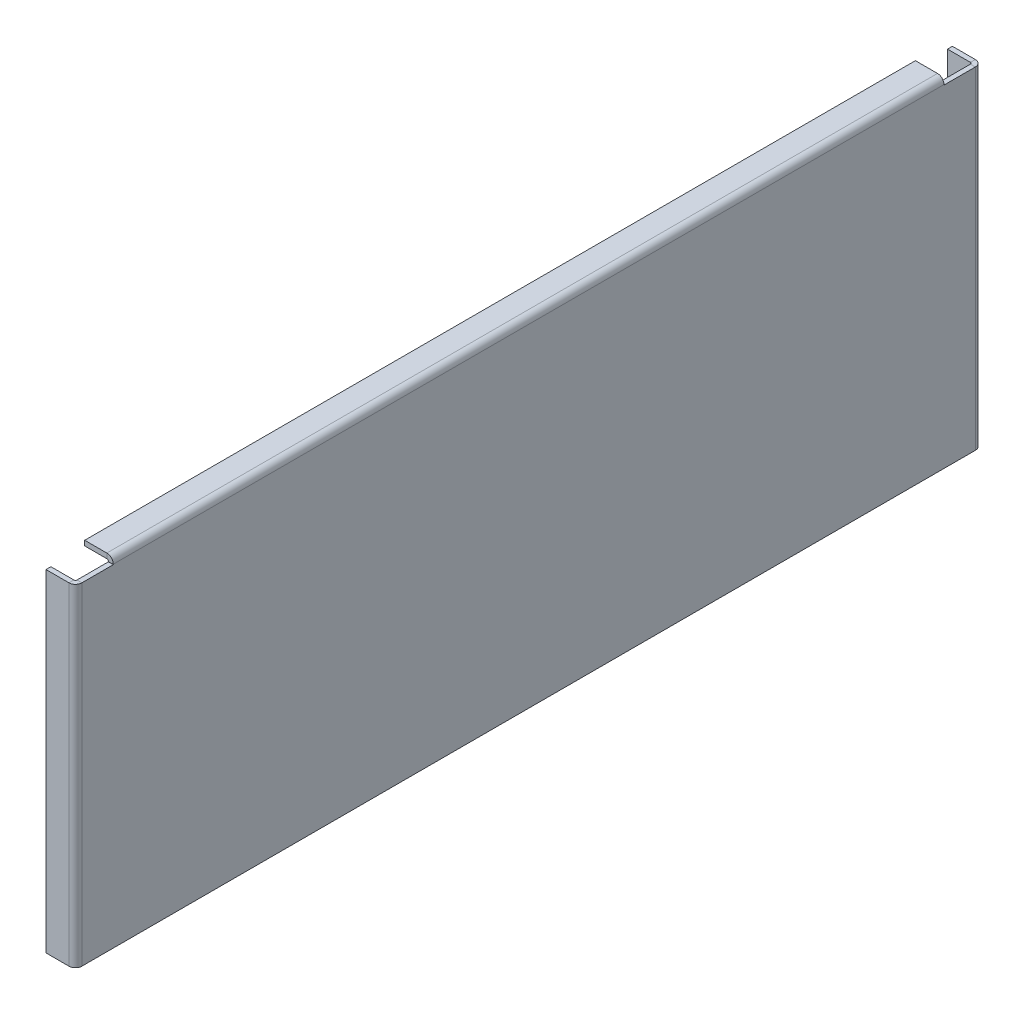
ISO-10303-21;
HEADER;
FILE_DESCRIPTION(('STEP AP214'),'2;1');
FILE_NAME('part.step','',(''),(''),'','','');
FILE_SCHEMA(('AUTOMOTIVE_DESIGN { 1 0 10303 214 1 1 1 1 }'));
ENDSEC;
DATA;
#1=APPLICATION_CONTEXT('core data for automotive mechanical design processes');
#2=APPLICATION_PROTOCOL_DEFINITION('international standard','automotive_design',2000,#1);
#3=PRODUCT_CONTEXT('',#1,'mechanical');
#4=PRODUCT('Part','Part','',(#3));
#5=PRODUCT_RELATED_PRODUCT_CATEGORY('part','',(#4));
#6=PRODUCT_DEFINITION_FORMATION('','',#4);
#7=PRODUCT_DEFINITION_CONTEXT('part definition',#1,'design');
#8=PRODUCT_DEFINITION('design','',#6,#7);
#9=PRODUCT_DEFINITION_SHAPE('','',#8);
#10=(LENGTH_UNIT() NAMED_UNIT(*) SI_UNIT(.MILLI.,.METRE.));
#11=(NAMED_UNIT(*) PLANE_ANGLE_UNIT() SI_UNIT($,.RADIAN.));
#12=(NAMED_UNIT(*) SI_UNIT($,.STERADIAN.) SOLID_ANGLE_UNIT());
#13=UNCERTAINTY_MEASURE_WITH_UNIT(LENGTH_MEASURE(1.E-05),#10,'distance_accuracy_value','');
#14=(GEOMETRIC_REPRESENTATION_CONTEXT(3) GLOBAL_UNCERTAINTY_ASSIGNED_CONTEXT((#13)) GLOBAL_UNIT_ASSIGNED_CONTEXT((#10,
#11,#12)) REPRESENTATION_CONTEXT('',''));
#15=CARTESIAN_POINT('',(0.,0.,0.));
#16=DIRECTION('',(0.,0.,1.));
#17=DIRECTION('',(1.,0.,0.));
#18=AXIS2_PLACEMENT_3D('',#15,#16,#17);
#19=CARTESIAN_POINT('',(-3.175,107.47375,287.655));
#20=DIRECTION('',(0.,1.,0.));
#21=DIRECTION('',(0.,0.,1.));
#22=AXIS2_PLACEMENT_3D('',#19,#20,#21);
#23=PLANE('',#22);
#24=DIRECTION('',(0.,0.,1.));
#25=VECTOR('',#24,1.);
#26=CARTESIAN_POINT('',(-3.175,107.47375,287.655));
#27=LINE('',#26,#25);
#28=CARTESIAN_POINT('',(-3.17500000000004,107.47375,-289.195));
#29=VERTEX_POINT('',#28);
#30=CARTESIAN_POINT('',(-3.17499999999997,107.47375,-268.875));
#31=VERTEX_POINT('',#30);
#32=EDGE_CURVE('E105',#29,#31,#27,.T.);
#33=ORIENTED_EDGE('',*,*,#32,.T.);
#34=DIRECTION('',(1.,0.,0.));
#35=VECTOR('',#34,1.);
#36=CARTESIAN_POINT('',(-3.17499999999997,107.47375,-268.875));
#37=LINE('',#36,#35);
#38=CARTESIAN_POINT('',(0.,107.47375,-268.875));
#39=VERTEX_POINT('',#38);
#40=EDGE_CURVE('E306',#31,#39,#37,.T.);
#41=ORIENTED_EDGE('',*,*,#40,.T.);
#42=DIRECTION('',(0.,0.,1.));
#43=VECTOR('',#42,1.);
#44=CARTESIAN_POINT('',(0.,107.47375,287.655));
#45=LINE('',#44,#43);
#46=CARTESIAN_POINT('',(0.,107.47375,-289.195));
#47=VERTEX_POINT('',#46);
#48=EDGE_CURVE('E424',#47,#39,#45,.T.);
#49=ORIENTED_EDGE('',*,*,#48,.F.);
#50=DIRECTION('',(1.,0.,0.));
#51=VECTOR('',#50,1.);
#52=CARTESIAN_POINT('',(-3.17500000000004,107.47375,-289.195));
#53=LINE('',#52,#51);
#54=EDGE_CURVE('E417',#29,#47,#53,.T.);
#55=ORIENTED_EDGE('',*,*,#54,.F.);
#56=EDGE_LOOP('',(#33,#41,#49,#55));
#57=FACE_BOUND('',#56,.T.);
#58=ADVANCED_FACE('F96',(#57),#23,.T.);
#59=CARTESIAN_POINT('',(-3.175,-107.47375,287.655));
#60=DIRECTION('',(0.,-1.,0.));
#61=DIRECTION('',(0.,0.,-1.));
#62=AXIS2_PLACEMENT_3D('',#59,#60,#61);
#63=PLANE('',#62);
#64=DIRECTION('',(0.,0.,-1.));
#65=VECTOR('',#64,1.);
#66=CARTESIAN_POINT('',(0.,-107.47375,287.655));
#67=LINE('',#66,#65);
#68=CARTESIAN_POINT('',(0.,-107.47375,289.195));
#69=VERTEX_POINT('',#68);
#70=CARTESIAN_POINT('',(0.,-107.47375,-289.195));
#71=VERTEX_POINT('',#70);
#72=EDGE_CURVE('E100',#69,#71,#67,.T.);
#73=ORIENTED_EDGE('',*,*,#72,.F.);
#74=DIRECTION('',(1.,0.,0.));
#75=VECTOR('',#74,1.);
#76=CARTESIAN_POINT('',(-3.17499999999998,-107.47375,289.195));
#77=LINE('',#76,#75);
#78=CARTESIAN_POINT('',(-3.17499999999998,-107.47375,289.195));
#79=VERTEX_POINT('',#78);
#80=EDGE_CURVE('E364',#79,#69,#77,.T.);
#81=ORIENTED_EDGE('',*,*,#80,.F.);
#82=DIRECTION('',(0.,0.,-1.));
#83=VECTOR('',#82,1.);
#84=CARTESIAN_POINT('',(-3.175,-107.47375,287.655));
#85=LINE('',#84,#83);
#86=CARTESIAN_POINT('',(-3.17500000000004,-107.47375,-289.195));
#87=VERTEX_POINT('',#86);
#88=EDGE_CURVE('E13',#79,#87,#85,.T.);
#89=ORIENTED_EDGE('',*,*,#88,.T.);
#90=DIRECTION('',(1.,0.,0.));
#91=VECTOR('',#90,1.);
#92=CARTESIAN_POINT('',(-3.17500000000004,-107.47375,-289.195));
#93=LINE('',#92,#91);
#94=EDGE_CURVE('E407',#87,#71,#93,.T.);
#95=ORIENTED_EDGE('',*,*,#94,.T.);
#96=EDGE_LOOP('',(#73,#81,#89,#95));
#97=FACE_BOUND('',#96,.T.);
#98=ADVANCED_FACE('F489',(#97),#63,.T.);
#99=DIRECTION('',(1.,0.,0.));
#100=VECTOR('',#99,1.);
#101=CARTESIAN_POINT('',(-3.17499999999997,107.47375,268.875));
#102=LINE('',#101,#100);
#103=CARTESIAN_POINT('',(-3.17499999999997,107.47375,268.875));
#104=VERTEX_POINT('',#103);
#105=CARTESIAN_POINT('',(0.,107.47375,268.875));
#106=VERTEX_POINT('',#105);
#107=EDGE_CURVE('E302',#104,#106,#102,.T.);
#108=ORIENTED_EDGE('',*,*,#107,.F.);
#109=CARTESIAN_POINT('',(-3.17499999999998,107.47375,289.195));
#110=VERTEX_POINT('',#109);
#111=EDGE_CURVE('E423',#104,#110,#27,.T.);
#112=ORIENTED_EDGE('',*,*,#111,.T.);
#113=DIRECTION('',(1.,0.,0.));
#114=VECTOR('',#113,1.);
#115=CARTESIAN_POINT('',(-3.17499999999998,107.47375,289.195));
#116=LINE('',#115,#114);
#117=CARTESIAN_POINT('',(0.,107.47375,289.195));
#118=VERTEX_POINT('',#117);
#119=EDGE_CURVE('E354',#110,#118,#116,.T.);
#120=ORIENTED_EDGE('',*,*,#119,.T.);
#121=EDGE_CURVE('E419',#106,#118,#45,.T.);
#122=ORIENTED_EDGE('',*,*,#121,.F.);
#123=EDGE_LOOP('',(#108,#112,#120,#122));
#124=FACE_BOUND('',#123,.T.);
#125=ADVANCED_FACE('F98',(#124),#23,.T.);
#126=CARTESIAN_POINT('',(-3.175,0.,0.));
#127=DIRECTION('',(1.,0.,0.));
#128=DIRECTION('',(0.,0.,-1.));
#129=AXIS2_PLACEMENT_3D('',#126,#127,#128);
#130=PLANE('',#129);
#131=ORIENTED_EDGE('',*,*,#32,.F.);
#132=DIRECTION('',(0.,-1.,0.));
#133=VECTOR('',#132,1.);
#134=CARTESIAN_POINT('',(-3.17500000000004,-107.47375,-289.195));
#135=LINE('',#134,#133);
#136=EDGE_CURVE('E413',#87,#29,#135,.F.);
#137=ORIENTED_EDGE('',*,*,#136,.F.);
#138=ORIENTED_EDGE('',*,*,#88,.F.);
#139=DIRECTION('',(0.,1.,0.));
#140=VECTOR('',#139,1.);
#141=CARTESIAN_POINT('',(-3.17499999999998,107.47375,289.195));
#142=LINE('',#141,#140);
#143=EDGE_CURVE('E360',#110,#79,#142,.F.);
#144=ORIENTED_EDGE('',*,*,#143,.F.);
#145=ORIENTED_EDGE('',*,*,#111,.F.);
#146=DIRECTION('',(0.,-1.,0.));
#147=VECTOR('',#146,1.);
#148=CARTESIAN_POINT('',(-3.17499999999997,107.74375,268.875));
#149=LINE('',#148,#147);
#150=CARTESIAN_POINT('',(-3.17499999999997,107.74375,268.875));
#151=VERTEX_POINT('',#150);
#152=EDGE_CURVE('E308',#151,#104,#149,.T.);
#153=ORIENTED_EDGE('',*,*,#152,.F.);
#154=DIRECTION('',(0.,0.,-1.));
#155=VECTOR('',#154,1.);
#156=CARTESIAN_POINT('',(-3.17499999999997,107.74375,-268.875));
#157=LINE('',#156,#155);
#158=CARTESIAN_POINT('',(-3.17499999999997,107.74375,-268.875));
#159=VERTEX_POINT('',#158);
#160=EDGE_CURVE('E296',#159,#151,#157,.F.);
#161=ORIENTED_EDGE('',*,*,#160,.F.);
#162=DIRECTION('',(0.,-1.,0.));
#163=VECTOR('',#162,1.);
#164=CARTESIAN_POINT('',(-3.17499999999997,107.74375,-268.875));
#165=LINE('',#164,#163);
#166=EDGE_CURVE('E312',#159,#31,#165,.T.);
#167=ORIENTED_EDGE('',*,*,#166,.T.);
#168=EDGE_LOOP('',(#131,#137,#138,#144,#145,#153,#161,#167));
#169=FACE_BOUND('',#168,.T.);
#170=ADVANCED_FACE('F448',(#169),#130,.F.);
#171=CARTESIAN_POINT('',(0.,0.,0.));
#172=DIRECTION('',(1.,0.,0.));
#173=DIRECTION('',(0.,0.,-1.));
#174=AXIS2_PLACEMENT_3D('',#171,#172,#173);
#175=PLANE('',#174);
#176=ORIENTED_EDGE('',*,*,#72,.T.);
#177=DIRECTION('',(0.,-1.,0.));
#178=VECTOR('',#177,1.);
#179=CARTESIAN_POINT('',(0.,-107.47375,-289.195));
#180=LINE('',#179,#178);
#181=EDGE_CURVE('E402',#71,#47,#180,.F.);
#182=ORIENTED_EDGE('',*,*,#181,.T.);
#183=ORIENTED_EDGE('',*,*,#48,.T.);
#184=DIRECTION('',(0.,-1.,0.));
#185=VECTOR('',#184,1.);
#186=CARTESIAN_POINT('',(0.,107.74375,-268.875));
#187=LINE('',#186,#185);
#188=CARTESIAN_POINT('',(0.,107.74375,-268.875));
#189=VERTEX_POINT('',#188);
#190=EDGE_CURVE('E113',#189,#39,#187,.T.);
#191=ORIENTED_EDGE('',*,*,#190,.F.);
#192=DIRECTION('',(0.,0.,-1.));
#193=VECTOR('',#192,1.);
#194=CARTESIAN_POINT('',(0.,107.74375,-268.875));
#195=LINE('',#194,#193);
#196=CARTESIAN_POINT('',(0.,107.74375,268.875));
#197=VERTEX_POINT('',#196);
#198=EDGE_CURVE('E243',#189,#197,#195,.F.);
#199=ORIENTED_EDGE('',*,*,#198,.T.);
#200=DIRECTION('',(0.,-1.,0.));
#201=VECTOR('',#200,1.);
#202=CARTESIAN_POINT('',(0.,107.74375,268.875));
#203=LINE('',#202,#201);
#204=EDGE_CURVE('E309',#197,#106,#203,.T.);
#205=ORIENTED_EDGE('',*,*,#204,.T.);
#206=ORIENTED_EDGE('',*,*,#121,.T.);
#207=DIRECTION('',(0.,1.,0.));
#208=VECTOR('',#207,1.);
#209=CARTESIAN_POINT('',(0.,107.47375,289.195));
#210=LINE('',#209,#208);
#211=EDGE_CURVE('E347',#118,#69,#210,.F.);
#212=ORIENTED_EDGE('',*,*,#211,.T.);
#213=EDGE_LOOP('',(#176,#182,#183,#191,#199,#205,#206,#212));
#214=FACE_BOUND('',#213,.T.);
#215=ADVANCED_FACE('F431',(#214),#175,.T.);
#216=CARTESIAN_POINT('',(-4.17499999999998,107.47375,-289.195));
#217=DIRECTION('',(0.,1.,0.));
#218=DIRECTION('',(0.,0.,1.));
#219=AXIS2_PLACEMENT_3D('',#216,#217,#218);
#220=PLANE('',#219);
#221=DIRECTION('',(0.,0.,-1.));
#222=VECTOR('',#221,1.);
#223=CARTESIAN_POINT('',(-4.17499999999998,107.47375,-293.37));
#224=LINE('',#223,#222);
#225=CARTESIAN_POINT('',(-4.17499999999998,107.47375,-290.195));
#226=VERTEX_POINT('',#225);
#227=CARTESIAN_POINT('',(-4.17499999999998,107.47375,-293.37));
#228=VERTEX_POINT('',#227);
#229=EDGE_CURVE('E367',#226,#228,#224,.T.);
#230=ORIENTED_EDGE('',*,*,#229,.F.);
#231=CARTESIAN_POINT('',(-4.17499999999998,107.47375,-289.195));
#232=DIRECTION('',(0.,-1.,0.));
#233=DIRECTION('',(0.,0.,-1.));
#234=AXIS2_PLACEMENT_3D('',#231,#232,#233);
#235=CIRCLE('',#234,0.999999999999945);
#236=EDGE_CURVE('E410',#29,#226,#235,.F.);
#237=ORIENTED_EDGE('',*,*,#236,.F.);
#238=ORIENTED_EDGE('',*,*,#54,.T.);
#239=CARTESIAN_POINT('',(-4.17499999999998,107.47375,-289.195));
#240=DIRECTION('',(0.,-1.,0.));
#241=DIRECTION('',(0.,0.,-1.));
#242=AXIS2_PLACEMENT_3D('',#239,#240,#241);
#243=CIRCLE('',#242,4.17499999999995);
#244=EDGE_CURVE('E121',#47,#228,#243,.F.);
#245=ORIENTED_EDGE('',*,*,#244,.T.);
#246=EDGE_LOOP('',(#230,#237,#238,#245));
#247=FACE_BOUND('',#246,.T.);
#248=ADVANCED_FACE('F503',(#247),#220,.T.);
#249=CARTESIAN_POINT('',(-4.17499999999998,-107.47375,-289.195));
#250=DIRECTION('',(0.,1.,0.));
#251=DIRECTION('',(0.,0.,1.));
#252=AXIS2_PLACEMENT_3D('',#249,#250,#251);
#253=PLANE('',#252);
#254=CARTESIAN_POINT('',(-4.17499999999998,-107.47375,-289.195));
#255=DIRECTION('',(0.,-1.,0.));
#256=DIRECTION('',(0.,0.,-1.));
#257=AXIS2_PLACEMENT_3D('',#254,#255,#256);
#258=CIRCLE('',#257,0.999999999999945);
#259=CARTESIAN_POINT('',(-4.17499999999998,-107.47375,-290.195));
#260=VERTEX_POINT('',#259);
#261=EDGE_CURVE('E372',#260,#87,#258,.T.);
#262=ORIENTED_EDGE('',*,*,#261,.F.);
#263=DIRECTION('',(0.,0.,-1.));
#264=VECTOR('',#263,1.);
#265=CARTESIAN_POINT('',(-4.17499999999998,-107.47375,-290.195));
#266=LINE('',#265,#264);
#267=CARTESIAN_POINT('',(-4.17499999999998,-107.47375,-293.37));
#268=VERTEX_POINT('',#267);
#269=EDGE_CURVE('E395',#260,#268,#266,.T.);
#270=ORIENTED_EDGE('',*,*,#269,.T.);
#271=CARTESIAN_POINT('',(-4.17499999999998,-107.47375,-289.195));
#272=DIRECTION('',(0.,-1.,0.));
#273=DIRECTION('',(0.,0.,-1.));
#274=AXIS2_PLACEMENT_3D('',#271,#272,#273);
#275=CIRCLE('',#274,4.17499999999995);
#276=EDGE_CURVE('E405',#268,#71,#275,.T.);
#277=ORIENTED_EDGE('',*,*,#276,.T.);
#278=ORIENTED_EDGE('',*,*,#94,.F.);
#279=EDGE_LOOP('',(#262,#270,#277,#278));
#280=FACE_BOUND('',#279,.T.);
#281=ADVANCED_FACE('F506',(#280),#253,.F.);
#282=CARTESIAN_POINT('',(-4.17499999999998,-107.47375,-289.195));
#283=DIRECTION('',(0.,-1.,0.));
#284=DIRECTION('',(0.,0.,-1.));
#285=AXIS2_PLACEMENT_3D('',#282,#283,#284);
#286=CYLINDRICAL_SURFACE('',#285,4.17499999999995);
#287=ORIENTED_EDGE('',*,*,#181,.F.);
#288=ORIENTED_EDGE('',*,*,#276,.F.);
#289=DIRECTION('',(0.,-1.,0.));
#290=VECTOR('',#289,1.);
#291=CARTESIAN_POINT('',(-4.17499999999998,0.,-293.37));
#292=LINE('',#291,#290);
#293=EDGE_CURVE('E392',#228,#268,#292,.T.);
#294=ORIENTED_EDGE('',*,*,#293,.F.);
#295=ORIENTED_EDGE('',*,*,#244,.F.);
#296=EDGE_LOOP('',(#287,#288,#294,#295));
#297=FACE_BOUND('',#296,.T.);
#298=ADVANCED_FACE('F509',(#297),#286,.T.);
#299=CARTESIAN_POINT('',(-4.17499999999998,-107.47375,-289.195));
#300=DIRECTION('',(0.,-1.,0.));
#301=DIRECTION('',(0.,0.,-1.));
#302=AXIS2_PLACEMENT_3D('',#299,#300,#301);
#303=CYLINDRICAL_SURFACE('',#302,0.999999999999945);
#304=ORIENTED_EDGE('',*,*,#136,.T.);
#305=ORIENTED_EDGE('',*,*,#236,.T.);
#306=DIRECTION('',(0.,1.,0.));
#307=VECTOR('',#306,1.);
#308=CARTESIAN_POINT('',(-4.17499999999998,107.47375,-290.195));
#309=LINE('',#308,#307);
#310=EDGE_CURVE('E398',#226,#260,#309,.F.);
#311=ORIENTED_EDGE('',*,*,#310,.T.);
#312=ORIENTED_EDGE('',*,*,#261,.T.);
#313=EDGE_LOOP('',(#304,#305,#311,#312));
#314=FACE_BOUND('',#313,.T.);
#315=ADVANCED_FACE('F514',(#314),#303,.F.);
#316=CARTESIAN_POINT('',(-3.17499999999999,-107.47375,-293.37));
#317=DIRECTION('',(0.,-1.,0.));
#318=DIRECTION('',(1.,0.,0.));
#319=AXIS2_PLACEMENT_3D('',#316,#317,#318);
#320=PLANE('',#319);
#321=DIRECTION('',(1.,0.,0.));
#322=VECTOR('',#321,1.);
#323=CARTESIAN_POINT('',(-3.17499999999999,-107.47375,-293.37));
#324=LINE('',#323,#322);
#325=CARTESIAN_POINT('',(-19.05,-107.47375,-293.37));
#326=VERTEX_POINT('',#325);
#327=EDGE_CURVE('E376',#326,#268,#324,.T.);
#328=ORIENTED_EDGE('',*,*,#327,.T.);
#329=ORIENTED_EDGE('',*,*,#269,.F.);
#330=DIRECTION('',(-1.,0.,0.));
#331=VECTOR('',#330,1.);
#332=CARTESIAN_POINT('',(-4.69763117294519E-13,-107.47375,-290.195));
#333=LINE('',#332,#331);
#334=CARTESIAN_POINT('',(-19.05,-107.47375,-290.195));
#335=VERTEX_POINT('',#334);
#336=EDGE_CURVE('E384',#335,#260,#333,.F.);
#337=ORIENTED_EDGE('',*,*,#336,.F.);
#338=DIRECTION('',(0.,0.,1.));
#339=VECTOR('',#338,1.);
#340=CARTESIAN_POINT('',(-19.05,-107.47375,-293.37));
#341=LINE('',#340,#339);
#342=EDGE_CURVE('E370',#326,#335,#341,.T.);
#343=ORIENTED_EDGE('',*,*,#342,.F.);
#344=EDGE_LOOP('',(#328,#329,#337,#343));
#345=FACE_BOUND('',#344,.T.);
#346=ADVANCED_FACE('F517',(#345),#320,.T.);
#347=CARTESIAN_POINT('',(-19.05,107.47375,-293.37));
#348=DIRECTION('',(0.,1.,0.));
#349=DIRECTION('',(-1.,0.,0.));
#350=AXIS2_PLACEMENT_3D('',#347,#348,#349);
#351=PLANE('',#350);
#352=DIRECTION('',(1.,0.,0.));
#353=VECTOR('',#352,1.);
#354=CARTESIAN_POINT('',(3.75810493835615E-13,107.47375,-290.195));
#355=LINE('',#354,#353);
#356=CARTESIAN_POINT('',(-19.05,107.47375,-290.195));
#357=VERTEX_POINT('',#356);
#358=EDGE_CURVE('E390',#226,#357,#355,.F.);
#359=ORIENTED_EDGE('',*,*,#358,.F.);
#360=ORIENTED_EDGE('',*,*,#229,.T.);
#361=DIRECTION('',(-1.,0.,0.));
#362=VECTOR('',#361,1.);
#363=CARTESIAN_POINT('',(-19.05,107.47375,-293.37));
#364=LINE('',#363,#362);
#365=CARTESIAN_POINT('',(-19.05,107.47375,-293.37));
#366=VERTEX_POINT('',#365);
#367=EDGE_CURVE('E382',#228,#366,#364,.T.);
#368=ORIENTED_EDGE('',*,*,#367,.T.);
#369=DIRECTION('',(0.,0.,1.));
#370=VECTOR('',#369,1.);
#371=CARTESIAN_POINT('',(-19.05,107.47375,-293.37));
#372=LINE('',#371,#370);
#373=EDGE_CURVE('E373',#366,#357,#372,.T.);
#374=ORIENTED_EDGE('',*,*,#373,.T.);
#375=EDGE_LOOP('',(#359,#360,#368,#374));
#376=FACE_BOUND('',#375,.T.);
#377=ADVANCED_FACE('F521',(#376),#351,.T.);
#378=CARTESIAN_POINT('',(0.,0.,-293.37));
#379=DIRECTION('',(0.,0.,-1.));
#380=DIRECTION('',(0.,1.,0.));
#381=AXIS2_PLACEMENT_3D('',#378,#379,#380);
#382=PLANE('',#381);
#383=ORIENTED_EDGE('',*,*,#367,.F.);
#384=ORIENTED_EDGE('',*,*,#293,.T.);
#385=ORIENTED_EDGE('',*,*,#327,.F.);
#386=DIRECTION('',(0.,-1.,0.));
#387=VECTOR('',#386,1.);
#388=CARTESIAN_POINT('',(-19.05,-107.47375,-293.37));
#389=LINE('',#388,#387);
#390=EDGE_CURVE('E379',#366,#326,#389,.T.);
#391=ORIENTED_EDGE('',*,*,#390,.F.);
#392=EDGE_LOOP('',(#383,#384,#385,#391));
#393=FACE_BOUND('',#392,.T.);
#394=ADVANCED_FACE('F524',(#393),#382,.T.);
#395=CARTESIAN_POINT('',(0.,0.,-290.195));
#396=DIRECTION('',(0.,0.,-1.));
#397=DIRECTION('',(0.,1.,0.));
#398=AXIS2_PLACEMENT_3D('',#395,#396,#397);
#399=PLANE('',#398);
#400=ORIENTED_EDGE('',*,*,#310,.F.);
#401=ORIENTED_EDGE('',*,*,#358,.T.);
#402=DIRECTION('',(0.,1.,0.));
#403=VECTOR('',#402,1.);
#404=CARTESIAN_POINT('',(-19.05,0.,-290.195));
#405=LINE('',#404,#403);
#406=EDGE_CURVE('E387',#357,#335,#405,.F.);
#407=ORIENTED_EDGE('',*,*,#406,.T.);
#408=ORIENTED_EDGE('',*,*,#336,.T.);
#409=EDGE_LOOP('',(#400,#401,#407,#408));
#410=FACE_BOUND('',#409,.T.);
#411=ADVANCED_FACE('F529',(#410),#399,.F.);
#412=CARTESIAN_POINT('',(-19.05,-107.47375,-293.37));
#413=DIRECTION('',(-1.,0.,0.));
#414=DIRECTION('',(0.,0.,1.));
#415=AXIS2_PLACEMENT_3D('',#412,#413,#414);
#416=PLANE('',#415);
#417=ORIENTED_EDGE('',*,*,#406,.F.);
#418=ORIENTED_EDGE('',*,*,#373,.F.);
#419=ORIENTED_EDGE('',*,*,#390,.T.);
#420=ORIENTED_EDGE('',*,*,#342,.T.);
#421=EDGE_LOOP('',(#417,#418,#419,#420));
#422=FACE_BOUND('',#421,.T.);
#423=ADVANCED_FACE('F526',(#422),#416,.T.);
#424=CARTESIAN_POINT('',(-4.17499999999998,-107.47375,289.195));
#425=DIRECTION('',(0.,-1.,0.));
#426=DIRECTION('',(0.,0.,-1.));
#427=AXIS2_PLACEMENT_3D('',#424,#425,#426);
#428=PLANE('',#427);
#429=DIRECTION('',(0.,0.,1.));
#430=VECTOR('',#429,1.);
#431=CARTESIAN_POINT('',(-4.17499999999998,-107.47375,293.37));
#432=LINE('',#431,#430);
#433=CARTESIAN_POINT('',(-4.17499999999998,-107.47375,290.195));
#434=VERTEX_POINT('',#433);
#435=CARTESIAN_POINT('',(-4.17499999999998,-107.47375,293.37));
#436=VERTEX_POINT('',#435);
#437=EDGE_CURVE('E314',#434,#436,#432,.T.);
#438=ORIENTED_EDGE('',*,*,#437,.F.);
#439=CARTESIAN_POINT('',(-4.17499999999998,-107.47375,289.195));
#440=DIRECTION('',(0.,1.,0.));
#441=DIRECTION('',(0.,0.,1.));
#442=AXIS2_PLACEMENT_3D('',#439,#440,#441);
#443=CIRCLE('',#442,1.);
#444=EDGE_CURVE('E357',#79,#434,#443,.F.);
#445=ORIENTED_EDGE('',*,*,#444,.F.);
#446=ORIENTED_EDGE('',*,*,#80,.T.);
#447=CARTESIAN_POINT('',(-4.17499999999998,-107.47375,289.195));
#448=DIRECTION('',(0.,1.,0.));
#449=DIRECTION('',(0.,0.,1.));
#450=AXIS2_PLACEMENT_3D('',#447,#448,#449);
#451=CIRCLE('',#450,4.175);
#452=EDGE_CURVE('E350',#69,#436,#451,.F.);
#453=ORIENTED_EDGE('',*,*,#452,.T.);
#454=EDGE_LOOP('',(#438,#445,#446,#453));
#455=FACE_BOUND('',#454,.T.);
#456=ADVANCED_FACE('F459',(#455),#428,.T.);
#457=CARTESIAN_POINT('',(-4.17499999999998,107.47375,289.195));
#458=DIRECTION('',(0.,-1.,0.));
#459=DIRECTION('',(0.,0.,-1.));
#460=AXIS2_PLACEMENT_3D('',#457,#458,#459);
#461=PLANE('',#460);
#462=CARTESIAN_POINT('',(-4.17499999999998,107.47375,289.195));
#463=DIRECTION('',(0.,1.,0.));
#464=DIRECTION('',(0.,0.,1.));
#465=AXIS2_PLACEMENT_3D('',#462,#463,#464);
#466=CIRCLE('',#465,1.);
#467=CARTESIAN_POINT('',(-4.17499999999998,107.47375,290.195));
#468=VERTEX_POINT('',#467);
#469=EDGE_CURVE('E318',#468,#110,#466,.T.);
#470=ORIENTED_EDGE('',*,*,#469,.F.);
#471=DIRECTION('',(0.,0.,1.));
#472=VECTOR('',#471,1.);
#473=CARTESIAN_POINT('',(-4.17499999999998,107.47375,290.195));
#474=LINE('',#473,#472);
#475=CARTESIAN_POINT('',(-4.17499999999998,107.47375,293.37));
#476=VERTEX_POINT('',#475);
#477=EDGE_CURVE('E340',#468,#476,#474,.T.);
#478=ORIENTED_EDGE('',*,*,#477,.T.);
#479=CARTESIAN_POINT('',(-4.17499999999998,107.47375,289.195));
#480=DIRECTION('',(0.,1.,0.));
#481=DIRECTION('',(0.,0.,1.));
#482=AXIS2_PLACEMENT_3D('',#479,#480,#481);
#483=CIRCLE('',#482,4.175);
#484=EDGE_CURVE('E351',#476,#118,#483,.T.);
#485=ORIENTED_EDGE('',*,*,#484,.T.);
#486=ORIENTED_EDGE('',*,*,#119,.F.);
#487=EDGE_LOOP('',(#470,#478,#485,#486));
#488=FACE_BOUND('',#487,.T.);
#489=ADVANCED_FACE('F440',(#488),#461,.F.);
#490=CARTESIAN_POINT('',(-4.17499999999998,107.47375,289.195));
#491=DIRECTION('',(0.,1.,0.));
#492=DIRECTION('',(0.,0.,1.));
#493=AXIS2_PLACEMENT_3D('',#490,#491,#492);
#494=CYLINDRICAL_SURFACE('',#493,4.175);
#495=ORIENTED_EDGE('',*,*,#211,.F.);
#496=ORIENTED_EDGE('',*,*,#484,.F.);
#497=DIRECTION('',(0.,1.,0.));
#498=VECTOR('',#497,1.);
#499=CARTESIAN_POINT('',(-4.17499999999998,-107.47375,293.37));
#500=LINE('',#499,#498);
#501=EDGE_CURVE('E338',#476,#436,#500,.F.);
#502=ORIENTED_EDGE('',*,*,#501,.T.);
#503=ORIENTED_EDGE('',*,*,#452,.F.);
#504=EDGE_LOOP('',(#495,#496,#502,#503));
#505=FACE_BOUND('',#504,.T.);
#506=ADVANCED_FACE('F436',(#505),#494,.T.);
#507=CARTESIAN_POINT('',(-4.17499999999998,107.47375,289.195));
#508=DIRECTION('',(0.,1.,0.));
#509=DIRECTION('',(0.,0.,1.));
#510=AXIS2_PLACEMENT_3D('',#507,#508,#509);
#511=CYLINDRICAL_SURFACE('',#510,1.);
#512=ORIENTED_EDGE('',*,*,#143,.T.);
#513=ORIENTED_EDGE('',*,*,#444,.T.);
#514=DIRECTION('',(0.,1.,0.));
#515=VECTOR('',#514,1.);
#516=CARTESIAN_POINT('',(-4.17499999999998,-107.47375,290.195));
#517=LINE('',#516,#515);
#518=EDGE_CURVE('E343',#434,#468,#517,.T.);
#519=ORIENTED_EDGE('',*,*,#518,.T.);
#520=ORIENTED_EDGE('',*,*,#469,.T.);
#521=EDGE_LOOP('',(#512,#513,#519,#520));
#522=FACE_BOUND('',#521,.T.);
#523=ADVANCED_FACE('F456',(#522),#511,.F.);
#524=CARTESIAN_POINT('',(-3.17499999999999,-107.47375,293.37));
#525=DIRECTION('',(0.,-1.,0.));
#526=DIRECTION('',(1.,0.,0.));
#527=AXIS2_PLACEMENT_3D('',#524,#525,#526);
#528=PLANE('',#527);
#529=DIRECTION('',(-1.,0.,0.));
#530=VECTOR('',#529,1.);
#531=CARTESIAN_POINT('',(0.,-107.47375,290.195));
#532=LINE('',#531,#530);
#533=CARTESIAN_POINT('',(-19.05,-107.47375,290.195));
#534=VERTEX_POINT('',#533);
#535=EDGE_CURVE('E336',#434,#534,#532,.T.);
#536=ORIENTED_EDGE('',*,*,#535,.F.);
#537=ORIENTED_EDGE('',*,*,#437,.T.);
#538=DIRECTION('',(1.,0.,0.));
#539=VECTOR('',#538,1.);
#540=CARTESIAN_POINT('',(-3.17499999999999,-107.47375,293.37));
#541=LINE('',#540,#539);
#542=CARTESIAN_POINT('',(-19.05,-107.47375,293.37));
#543=VERTEX_POINT('',#542);
#544=EDGE_CURVE('E328',#436,#543,#541,.F.);
#545=ORIENTED_EDGE('',*,*,#544,.T.);
#546=DIRECTION('',(0.,0.,-1.));
#547=VECTOR('',#546,1.);
#548=CARTESIAN_POINT('',(-19.05,-107.47375,293.37));
#549=LINE('',#548,#547);
#550=EDGE_CURVE('E319',#543,#534,#549,.T.);
#551=ORIENTED_EDGE('',*,*,#550,.T.);
#552=EDGE_LOOP('',(#536,#537,#545,#551));
#553=FACE_BOUND('',#552,.T.);
#554=ADVANCED_FACE('F464',(#553),#528,.T.);
#555=CARTESIAN_POINT('',(-19.05,107.47375,293.37));
#556=DIRECTION('',(0.,1.,0.));
#557=DIRECTION('',(-1.,0.,0.));
#558=AXIS2_PLACEMENT_3D('',#555,#556,#557);
#559=PLANE('',#558);
#560=DIRECTION('',(-1.,0.,0.));
#561=VECTOR('',#560,1.);
#562=CARTESIAN_POINT('',(-19.05,107.47375,293.37));
#563=LINE('',#562,#561);
#564=CARTESIAN_POINT('',(-19.05,107.47375,293.37));
#565=VERTEX_POINT('',#564);
#566=EDGE_CURVE('E322',#565,#476,#563,.F.);
#567=ORIENTED_EDGE('',*,*,#566,.T.);
#568=ORIENTED_EDGE('',*,*,#477,.F.);
#569=DIRECTION('',(1.,0.,0.));
#570=VECTOR('',#569,1.);
#571=CARTESIAN_POINT('',(-1.87905246917808E-13,107.47375,290.195));
#572=LINE('',#571,#570);
#573=CARTESIAN_POINT('',(-19.05,107.47375,290.195));
#574=VERTEX_POINT('',#573);
#575=EDGE_CURVE('E330',#574,#468,#572,.T.);
#576=ORIENTED_EDGE('',*,*,#575,.F.);
#577=DIRECTION('',(0.,0.,-1.));
#578=VECTOR('',#577,1.);
#579=CARTESIAN_POINT('',(-19.05,107.47375,293.37));
#580=LINE('',#579,#578);
#581=EDGE_CURVE('E316',#565,#574,#580,.T.);
#582=ORIENTED_EDGE('',*,*,#581,.F.);
#583=EDGE_LOOP('',(#567,#568,#576,#582));
#584=FACE_BOUND('',#583,.T.);
#585=ADVANCED_FACE('F477',(#584),#559,.T.);
#586=CARTESIAN_POINT('',(0.,0.,293.37));
#587=DIRECTION('',(0.,0.,-1.));
#588=DIRECTION('',(0.,1.,0.));
#589=AXIS2_PLACEMENT_3D('',#586,#587,#588);
#590=PLANE('',#589);
#591=ORIENTED_EDGE('',*,*,#501,.F.);
#592=ORIENTED_EDGE('',*,*,#566,.F.);
#593=DIRECTION('',(0.,-1.,0.));
#594=VECTOR('',#593,1.);
#595=CARTESIAN_POINT('',(-19.05,-107.47375,293.37));
#596=LINE('',#595,#594);
#597=EDGE_CURVE('E325',#543,#565,#596,.F.);
#598=ORIENTED_EDGE('',*,*,#597,.F.);
#599=ORIENTED_EDGE('',*,*,#544,.F.);
#600=EDGE_LOOP('',(#591,#592,#598,#599));
#601=FACE_BOUND('',#600,.T.);
#602=ADVANCED_FACE('F468',(#601),#590,.F.);
#603=CARTESIAN_POINT('',(0.,0.,290.195));
#604=DIRECTION('',(0.,0.,-1.));
#605=DIRECTION('',(0.,1.,0.));
#606=AXIS2_PLACEMENT_3D('',#603,#604,#605);
#607=PLANE('',#606);
#608=ORIENTED_EDGE('',*,*,#575,.T.);
#609=ORIENTED_EDGE('',*,*,#518,.F.);
#610=ORIENTED_EDGE('',*,*,#535,.T.);
#611=DIRECTION('',(0.,1.,0.));
#612=VECTOR('',#611,1.);
#613=CARTESIAN_POINT('',(-19.05,0.,290.195));
#614=LINE('',#613,#612);
#615=EDGE_CURVE('E333',#534,#574,#614,.T.);
#616=ORIENTED_EDGE('',*,*,#615,.T.);
#617=EDGE_LOOP('',(#608,#609,#610,#616));
#618=FACE_BOUND('',#617,.T.);
#619=ADVANCED_FACE('F475',(#618),#607,.T.);
#620=CARTESIAN_POINT('',(-19.05,-107.47375,293.37));
#621=DIRECTION('',(-1.,0.,0.));
#622=DIRECTION('',(0.,0.,1.));
#623=AXIS2_PLACEMENT_3D('',#620,#621,#622);
#624=PLANE('',#623);
#625=ORIENTED_EDGE('',*,*,#615,.F.);
#626=ORIENTED_EDGE('',*,*,#550,.F.);
#627=ORIENTED_EDGE('',*,*,#597,.T.);
#628=ORIENTED_EDGE('',*,*,#581,.T.);
#629=EDGE_LOOP('',(#625,#626,#627,#628));
#630=FACE_BOUND('',#629,.T.);
#631=ADVANCED_FACE('F472',(#630),#624,.T.);
#632=CARTESIAN_POINT('',(-3.17499999999997,107.74375,-268.875));
#633=DIRECTION('',(0.,0.,-1.));
#634=DIRECTION('',(1.,0.,0.));
#635=AXIS2_PLACEMENT_3D('',#632,#633,#634);
#636=PLANE('',#635);
#637=ORIENTED_EDGE('',*,*,#166,.F.);
#638=DIRECTION('',(1.,0.,0.));
#639=VECTOR('',#638,1.);
#640=CARTESIAN_POINT('',(-3.17499999999997,107.74375,-268.875));
#641=LINE('',#640,#639);
#642=EDGE_CURVE('E292',#159,#189,#641,.T.);
#643=ORIENTED_EDGE('',*,*,#642,.T.);
#644=ORIENTED_EDGE('',*,*,#190,.T.);
#645=ORIENTED_EDGE('',*,*,#40,.F.);
#646=EDGE_LOOP('',(#637,#643,#644,#645));
#647=FACE_BOUND('',#646,.T.);
#648=ADVANCED_FACE('F548',(#647),#636,.T.);
#649=CARTESIAN_POINT('',(-3.17499999999997,107.74375,268.875));
#650=DIRECTION('',(0.,0.,-1.));
#651=DIRECTION('',(1.,0.,0.));
#652=AXIS2_PLACEMENT_3D('',#649,#650,#651);
#653=PLANE('',#652);
#654=ORIENTED_EDGE('',*,*,#204,.F.);
#655=DIRECTION('',(1.,0.,0.));
#656=VECTOR('',#655,1.);
#657=CARTESIAN_POINT('',(-3.17499999999997,107.74375,268.875));
#658=LINE('',#657,#656);
#659=EDGE_CURVE('E299',#151,#197,#658,.T.);
#660=ORIENTED_EDGE('',*,*,#659,.F.);
#661=ORIENTED_EDGE('',*,*,#152,.T.);
#662=ORIENTED_EDGE('',*,*,#107,.T.);
#663=EDGE_LOOP('',(#654,#660,#661,#662));
#664=FACE_BOUND('',#663,.T.);
#665=ADVANCED_FACE('F553',(#664),#653,.F.);
#666=CARTESIAN_POINT('',(-4.17499999999997,107.74375,268.875));
#667=DIRECTION('',(0.,0.,1.));
#668=DIRECTION('',(1.,0.,0.));
#669=AXIS2_PLACEMENT_3D('',#666,#667,#668);
#670=PLANE('',#669);
#671=DIRECTION('',(0.,1.,0.));
#672=VECTOR('',#671,1.);
#673=CARTESIAN_POINT('',(-4.17499999999997,111.91875,268.875));
#674=LINE('',#673,#672);
#675=CARTESIAN_POINT('',(-4.17499999999996,108.74375,268.875));
#676=VERTEX_POINT('',#675);
#677=CARTESIAN_POINT('',(-4.17499999999995,111.91875,268.875));
#678=VERTEX_POINT('',#677);
#679=EDGE_CURVE('E287',#676,#678,#674,.T.);
#680=ORIENTED_EDGE('',*,*,#679,.F.);
#681=CARTESIAN_POINT('',(-4.17499999999997,107.74375,268.875));
#682=DIRECTION('',(0.,0.,-1.));
#683=DIRECTION('',(-1.,0.,0.));
#684=AXIS2_PLACEMENT_3D('',#681,#682,#683);
#685=CIRCLE('',#684,1.);
#686=EDGE_CURVE('E245',#151,#676,#685,.F.);
#687=ORIENTED_EDGE('',*,*,#686,.F.);
#688=ORIENTED_EDGE('',*,*,#659,.T.);
#689=CARTESIAN_POINT('',(-4.17499999999997,107.74375,268.875));
#690=DIRECTION('',(0.,0.,-1.));
#691=DIRECTION('',(-1.,0.,0.));
#692=AXIS2_PLACEMENT_3D('',#689,#690,#691);
#693=CIRCLE('',#692,4.175);
#694=EDGE_CURVE('E291',#197,#678,#693,.F.);
#695=ORIENTED_EDGE('',*,*,#694,.T.);
#696=EDGE_LOOP('',(#680,#687,#688,#695));
#697=FACE_BOUND('',#696,.T.);
#698=ADVANCED_FACE('F560',(#697),#670,.T.);
#699=CARTESIAN_POINT('',(-4.17499999999997,107.74375,-268.875));
#700=DIRECTION('',(0.,0.,1.));
#701=DIRECTION('',(1.,0.,0.));
#702=AXIS2_PLACEMENT_3D('',#699,#700,#701);
#703=PLANE('',#702);
#704=CARTESIAN_POINT('',(-4.17499999999997,107.74375,-268.875));
#705=DIRECTION('',(0.,0.,-1.));
#706=DIRECTION('',(-1.,0.,0.));
#707=AXIS2_PLACEMENT_3D('',#704,#705,#706);
#708=CIRCLE('',#707,1.);
#709=CARTESIAN_POINT('',(-4.17499999999996,108.74375,-268.875));
#710=VERTEX_POINT('',#709);
#711=EDGE_CURVE('E252',#710,#159,#708,.T.);
#712=ORIENTED_EDGE('',*,*,#711,.F.);
#713=DIRECTION('',(0.,1.,0.));
#714=VECTOR('',#713,1.);
#715=CARTESIAN_POINT('',(-4.17499999999994,108.74375,-268.875));
#716=LINE('',#715,#714);
#717=CARTESIAN_POINT('',(-4.17499999999993,111.91875,-268.875));
#718=VERTEX_POINT('',#717);
#719=EDGE_CURVE('E249',#710,#718,#716,.T.);
#720=ORIENTED_EDGE('',*,*,#719,.T.);
#721=CARTESIAN_POINT('',(-4.17499999999997,107.74375,-268.875));
#722=DIRECTION('',(0.,0.,-1.));
#723=DIRECTION('',(-1.,0.,0.));
#724=AXIS2_PLACEMENT_3D('',#721,#722,#723);
#725=CIRCLE('',#724,4.175);
#726=EDGE_CURVE('E236',#718,#189,#725,.T.);
#727=ORIENTED_EDGE('',*,*,#726,.T.);
#728=ORIENTED_EDGE('',*,*,#642,.F.);
#729=EDGE_LOOP('',(#712,#720,#727,#728));
#730=FACE_BOUND('',#729,.T.);
#731=ADVANCED_FACE('F250',(#730),#703,.F.);
#732=CARTESIAN_POINT('',(-4.17499999999997,107.74375,-268.875));
#733=DIRECTION('',(0.,0.,-1.));
#734=DIRECTION('',(0.,1.,0.));
#735=AXIS2_PLACEMENT_3D('',#732,#733,#734);
#736=CYLINDRICAL_SURFACE('',#735,4.175);
#737=ORIENTED_EDGE('',*,*,#198,.F.);
#738=ORIENTED_EDGE('',*,*,#726,.F.);
#739=DIRECTION('',(0.,0.,-1.));
#740=VECTOR('',#739,1.);
#741=CARTESIAN_POINT('',(-4.17499999999995,111.91875,0.));
#742=LINE('',#741,#740);
#743=EDGE_CURVE('E240',#678,#718,#742,.T.);
#744=ORIENTED_EDGE('',*,*,#743,.F.);
#745=ORIENTED_EDGE('',*,*,#694,.F.);
#746=EDGE_LOOP('',(#737,#738,#744,#745));
#747=FACE_BOUND('',#746,.T.);
#748=ADVANCED_FACE('F238',(#747),#736,.T.);
#749=CARTESIAN_POINT('',(-4.17499999999997,107.74375,-268.875));
#750=DIRECTION('',(0.,0.,-1.));
#751=DIRECTION('',(0.,1.,0.));
#752=AXIS2_PLACEMENT_3D('',#749,#750,#751);
#753=CYLINDRICAL_SURFACE('',#752,1.);
#754=ORIENTED_EDGE('',*,*,#160,.T.);
#755=ORIENTED_EDGE('',*,*,#686,.T.);
#756=DIRECTION('',(0.,0.,1.));
#757=VECTOR('',#756,1.);
#758=CARTESIAN_POINT('',(-4.17499999999998,108.74375,268.875));
#759=LINE('',#758,#757);
#760=EDGE_CURVE('E257',#676,#710,#759,.F.);
#761=ORIENTED_EDGE('',*,*,#760,.T.);
#762=ORIENTED_EDGE('',*,*,#711,.T.);
#763=EDGE_LOOP('',(#754,#755,#761,#762));
#764=FACE_BOUND('',#763,.T.);
#765=ADVANCED_FACE('F567',(#764),#753,.F.);
#766=CARTESIAN_POINT('',(-3.17499999999992,111.91875,-268.875));
#767=DIRECTION('',(0.,0.,-1.));
#768=DIRECTION('',(0.,1.,0.));
#769=AXIS2_PLACEMENT_3D('',#766,#767,#768);
#770=PLANE('',#769);
#771=DIRECTION('',(1.,0.,0.));
#772=VECTOR('',#771,1.);
#773=CARTESIAN_POINT('',(-3.17499999999992,111.91875,-268.875));
#774=LINE('',#773,#772);
#775=CARTESIAN_POINT('',(-18.5018697130745,111.91875,-268.875));
#776=VERTEX_POINT('',#775);
#777=EDGE_CURVE('E264',#776,#718,#774,.T.);
#778=ORIENTED_EDGE('',*,*,#777,.T.);
#779=ORIENTED_EDGE('',*,*,#719,.F.);
#780=DIRECTION('',(-1.,0.,0.));
#781=VECTOR('',#780,1.);
#782=CARTESIAN_POINT('',(3.8925049284859E-13,108.74375,-268.875));
#783=LINE('',#782,#781);
#784=CARTESIAN_POINT('',(-18.5018697130745,108.74375,-268.875));
#785=VERTEX_POINT('',#784);
#786=EDGE_CURVE('E280',#785,#710,#783,.F.);
#787=ORIENTED_EDGE('',*,*,#786,.F.);
#788=DIRECTION('',(0.,-1.,0.));
#789=VECTOR('',#788,1.);
#790=CARTESIAN_POINT('',(-18.5018697130745,111.91875,-268.875));
#791=LINE('',#790,#789);
#792=EDGE_CURVE('E269',#776,#785,#791,.T.);
#793=ORIENTED_EDGE('',*,*,#792,.F.);
#794=EDGE_LOOP('',(#778,#779,#787,#793));
#795=FACE_BOUND('',#794,.T.);
#796=ADVANCED_FACE('F268',(#795),#770,.T.);
#797=CARTESIAN_POINT('',(-18.5018697130744,111.91875,268.875));
#798=DIRECTION('',(0.,0.,1.));
#799=DIRECTION('',(0.,-1.,0.));
#800=AXIS2_PLACEMENT_3D('',#797,#798,#799);
#801=PLANE('',#800);
#802=DIRECTION('',(1.,0.,0.));
#803=VECTOR('',#802,1.);
#804=CARTESIAN_POINT('',(3.8925049284859E-13,108.74375,268.875));
#805=LINE('',#804,#803);
#806=CARTESIAN_POINT('',(-18.5018697130744,108.74375,268.875));
#807=VERTEX_POINT('',#806);
#808=EDGE_CURVE('E266',#676,#807,#805,.F.);
#809=ORIENTED_EDGE('',*,*,#808,.F.);
#810=ORIENTED_EDGE('',*,*,#679,.T.);
#811=DIRECTION('',(-1.,0.,0.));
#812=VECTOR('',#811,1.);
#813=CARTESIAN_POINT('',(-18.5018697130744,111.91875,268.875));
#814=LINE('',#813,#812);
#815=CARTESIAN_POINT('',(-18.5018697130744,111.91875,268.875));
#816=VERTEX_POINT('',#815);
#817=EDGE_CURVE('E265',#678,#816,#814,.T.);
#818=ORIENTED_EDGE('',*,*,#817,.T.);
#819=DIRECTION('',(0.,-1.,0.));
#820=VECTOR('',#819,1.);
#821=CARTESIAN_POINT('',(-18.5018697130744,111.91875,268.875));
#822=LINE('',#821,#820);
#823=EDGE_CURVE('E271',#816,#807,#822,.T.);
#824=ORIENTED_EDGE('',*,*,#823,.T.);
#825=EDGE_LOOP('',(#809,#810,#818,#824));
#826=FACE_BOUND('',#825,.T.);
#827=ADVANCED_FACE('F573',(#826),#801,.T.);
#828=CARTESIAN_POINT('',(4.00335946099417E-13,111.91875,0.));
#829=DIRECTION('',(0.,1.,0.));
#830=DIRECTION('',(-1.,0.,0.));
#831=AXIS2_PLACEMENT_3D('',#828,#829,#830);
#832=PLANE('',#831);
#833=ORIENTED_EDGE('',*,*,#817,.F.);
#834=ORIENTED_EDGE('',*,*,#743,.T.);
#835=ORIENTED_EDGE('',*,*,#777,.F.);
#836=DIRECTION('',(0.,0.,-1.));
#837=VECTOR('',#836,1.);
#838=CARTESIAN_POINT('',(-18.5018697130745,111.91875,-268.875));
#839=LINE('',#838,#837);
#840=EDGE_CURVE('E272',#816,#776,#839,.T.);
#841=ORIENTED_EDGE('',*,*,#840,.F.);
#842=EDGE_LOOP('',(#833,#834,#835,#841));
#843=FACE_BOUND('',#842,.T.);
#844=ADVANCED_FACE('F262',(#843),#832,.T.);
#845=CARTESIAN_POINT('',(3.8925049284859E-13,108.74375,0.));
#846=DIRECTION('',(0.,1.,0.));
#847=DIRECTION('',(-1.,0.,0.));
#848=AXIS2_PLACEMENT_3D('',#845,#846,#847);
#849=PLANE('',#848);
#850=ORIENTED_EDGE('',*,*,#760,.F.);
#851=ORIENTED_EDGE('',*,*,#808,.T.);
#852=DIRECTION('',(0.,0.,1.));
#853=VECTOR('',#852,1.);
#854=CARTESIAN_POINT('',(-18.5018697130745,108.74375,0.));
#855=LINE('',#854,#853);
#856=EDGE_CURVE('E282',#807,#785,#855,.F.);
#857=ORIENTED_EDGE('',*,*,#856,.T.);
#858=ORIENTED_EDGE('',*,*,#786,.T.);
#859=EDGE_LOOP('',(#850,#851,#857,#858));
#860=FACE_BOUND('',#859,.T.);
#861=ADVANCED_FACE('F580',(#860),#849,.F.);
#862=CARTESIAN_POINT('',(-18.5018697130745,111.91875,-268.875));
#863=DIRECTION('',(-1.,0.,0.));
#864=DIRECTION('',(0.,-1.,0.));
#865=AXIS2_PLACEMENT_3D('',#862,#863,#864);
#866=PLANE('',#865);
#867=ORIENTED_EDGE('',*,*,#856,.F.);
#868=ORIENTED_EDGE('',*,*,#823,.F.);
#869=ORIENTED_EDGE('',*,*,#840,.T.);
#870=ORIENTED_EDGE('',*,*,#792,.T.);
#871=EDGE_LOOP('',(#867,#868,#869,#870));
#872=FACE_BOUND('',#871,.T.);
#873=ADVANCED_FACE('F577',(#872),#866,.T.);
#874=CLOSED_SHELL('',(#58,#98,#125,#170,#215,#248,#281,#298,#315,#346,#377,#394,#411,#423,#456,
#489,#506,#523,#554,#585,#602,#619,#631,#648,#665,#698,#731,#748,#765,#796,#827,#844,#861,#873));
#875=MANIFOLD_SOLID_BREP('B2',#874);
#876=ADVANCED_BREP_SHAPE_REPRESENTATION('',(#18,#875),#14);
#877=SHAPE_DEFINITION_REPRESENTATION(#9,#876);
ENDSEC;
END-ISO-10303-21;
